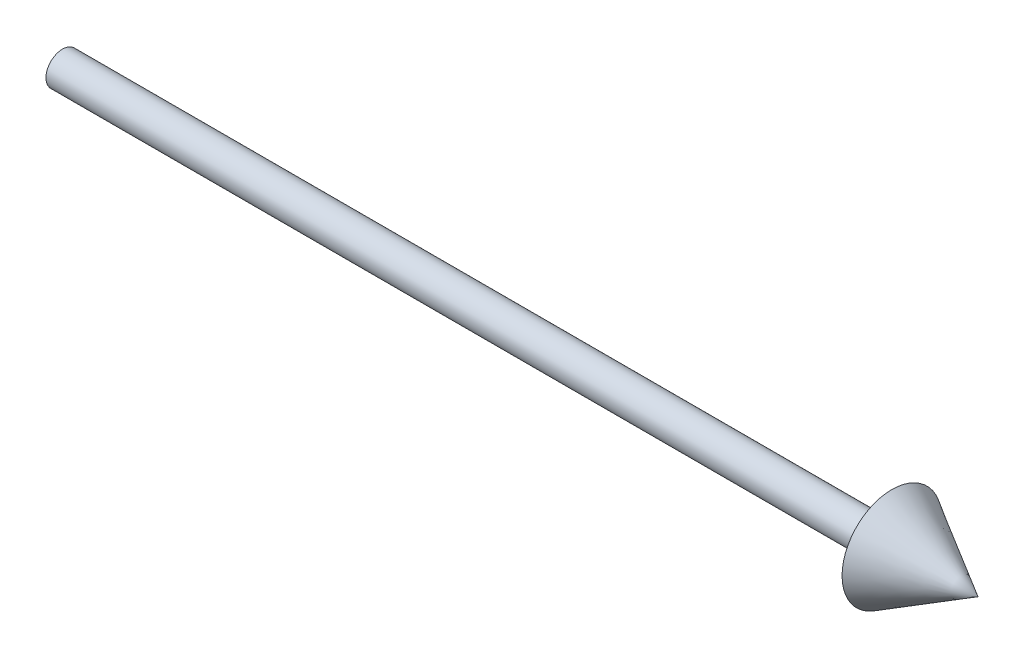
ISO-10303-21;
HEADER;
FILE_DESCRIPTION(('STEP AP214'),'2;1');
FILE_NAME('part.step','',(''),(''),'','','');
FILE_SCHEMA(('AUTOMOTIVE_DESIGN { 1 0 10303 214 1 1 1 1 }'));
ENDSEC;
DATA;
#1=APPLICATION_CONTEXT('core data for automotive mechanical design processes');
#2=APPLICATION_PROTOCOL_DEFINITION('international standard','automotive_design',2000,#1);
#3=PRODUCT_CONTEXT('',#1,'mechanical');
#4=PRODUCT('Part','Part','',(#3));
#5=PRODUCT_RELATED_PRODUCT_CATEGORY('part','',(#4));
#6=PRODUCT_DEFINITION_FORMATION('','',#4);
#7=PRODUCT_DEFINITION_CONTEXT('part definition',#1,'design');
#8=PRODUCT_DEFINITION('design','',#6,#7);
#9=PRODUCT_DEFINITION_SHAPE('','',#8);
#10=(LENGTH_UNIT() NAMED_UNIT(*) SI_UNIT(.MILLI.,.METRE.));
#11=(NAMED_UNIT(*) PLANE_ANGLE_UNIT() SI_UNIT($,.RADIAN.));
#12=(NAMED_UNIT(*) SI_UNIT($,.STERADIAN.) SOLID_ANGLE_UNIT());
#13=UNCERTAINTY_MEASURE_WITH_UNIT(LENGTH_MEASURE(1.E-05),#10,'distance_accuracy_value','');
#14=(GEOMETRIC_REPRESENTATION_CONTEXT(3) GLOBAL_UNCERTAINTY_ASSIGNED_CONTEXT((#13)) GLOBAL_UNIT_ASSIGNED_CONTEXT((#10,
#11,#12)) REPRESENTATION_CONTEXT('',''));
#15=CARTESIAN_POINT('',(0.,0.,0.));
#16=DIRECTION('',(0.,0.,1.));
#17=DIRECTION('',(1.,0.,0.));
#18=AXIS2_PLACEMENT_3D('',#15,#16,#17);
#19=CARTESIAN_POINT('',(50.,0.,0.));
#20=DIRECTION('',(-1.,0.,0.));
#21=DIRECTION('',(0.,0.,1.));
#22=AXIS2_PLACEMENT_3D('',#19,#20,#21);
#23=CONICAL_SURFACE('',#22,3.,0.523598775598304);
#24=CARTESIAN_POINT('',(55.1961524227066,0.,0.));
#25=VERTEX_POINT('',#24);
#26=VERTEX_LOOP('',#25);
#27=FACE_BOUND('',#26,.T.);
#28=CARTESIAN_POINT('',(50.,0.,0.));
#29=DIRECTION('',(1.,0.,0.));
#30=DIRECTION('',(0.,0.,-1.));
#31=AXIS2_PLACEMENT_3D('',#28,#29,#30);
#32=CIRCLE('',#31,3.);
#33=CARTESIAN_POINT('',(50.,0.,-3.));
#34=VERTEX_POINT('',#33);
#35=EDGE_CURVE('E12',#34,#34,#32,.T.);
#36=ORIENTED_EDGE('',*,*,#35,.T.);
#37=EDGE_LOOP('',(#36));
#38=FACE_BOUND('',#37,.T.);
#39=ADVANCED_FACE('F51',(#27,#38),#23,.T.);
#40=CARTESIAN_POINT('',(50.,0.,0.));
#41=DIRECTION('',(1.,0.,0.));
#42=DIRECTION('',(0.,0.,-1.));
#43=AXIS2_PLACEMENT_3D('',#40,#41,#42);
#44=PLANE('',#43);
#45=ORIENTED_EDGE('',*,*,#35,.F.);
#46=EDGE_LOOP('',(#45));
#47=FACE_BOUND('',#46,.T.);
#48=ADVANCED_FACE('F60',(#47),#44,.F.);
#49=CLOSED_SHELL('',(#39,#48));
#50=MANIFOLD_SOLID_BREP('B2',#49);
#51=CARTESIAN_POINT('',(50.,0.,0.));
#52=DIRECTION('',(-1.,0.,0.));
#53=DIRECTION('',(0.,0.,1.));
#54=AXIS2_PLACEMENT_3D('',#51,#52,#53);
#55=CYLINDRICAL_SURFACE('',#54,1.);
#56=CARTESIAN_POINT('',(50.,0.,0.));
#57=DIRECTION('',(1.,0.,0.));
#58=DIRECTION('',(0.,0.,-1.));
#59=AXIS2_PLACEMENT_3D('',#56,#57,#58);
#60=CIRCLE('',#59,1.);
#61=CARTESIAN_POINT('',(50.,0.,-1.));
#62=VERTEX_POINT('',#61);
#63=EDGE_CURVE('E50',#62,#62,#60,.T.);
#64=ORIENTED_EDGE('',*,*,#63,.F.);
#65=EDGE_LOOP('',(#64));
#66=FACE_BOUND('',#65,.T.);
#67=CARTESIAN_POINT('',(0.,0.,0.));
#68=DIRECTION('',(1.,0.,0.));
#69=DIRECTION('',(0.,0.,-1.));
#70=AXIS2_PLACEMENT_3D('',#67,#68,#69);
#71=CIRCLE('',#70,1.);
#72=CARTESIAN_POINT('',(0.,0.,-1.));
#73=VERTEX_POINT('',#72);
#74=EDGE_CURVE('E86',#73,#73,#71,.T.);
#75=ORIENTED_EDGE('',*,*,#74,.T.);
#76=EDGE_LOOP('',(#75));
#77=FACE_BOUND('',#76,.T.);
#78=ADVANCED_FACE('F83',(#66,#77),#55,.T.);
#79=CARTESIAN_POINT('',(50.,0.,0.));
#80=DIRECTION('',(1.,0.,0.));
#81=DIRECTION('',(0.,0.,-1.));
#82=AXIS2_PLACEMENT_3D('',#79,#80,#81);
#83=PLANE('',#82);
#84=ORIENTED_EDGE('',*,*,#63,.T.);
#85=EDGE_LOOP('',(#84));
#86=FACE_BOUND('',#85,.T.);
#87=ADVANCED_FACE('F100',(#86),#83,.T.);
#88=CARTESIAN_POINT('',(0.,0.,0.));
#89=DIRECTION('',(1.,0.,0.));
#90=DIRECTION('',(0.,0.,-1.));
#91=AXIS2_PLACEMENT_3D('',#88,#89,#90);
#92=PLANE('',#91);
#93=ORIENTED_EDGE('',*,*,#74,.F.);
#94=EDGE_LOOP('',(#93));
#95=FACE_BOUND('',#94,.T.);
#96=ADVANCED_FACE('F98',(#95),#92,.F.);
#97=CLOSED_SHELL('',(#78,#87,#96));
#98=MANIFOLD_SOLID_BREP('B6',#97);
#99=ADVANCED_BREP_SHAPE_REPRESENTATION('',(#18,#50,#98),#14);
#100=SHAPE_DEFINITION_REPRESENTATION(#9,#99);
ENDSEC;
END-ISO-10303-21;
